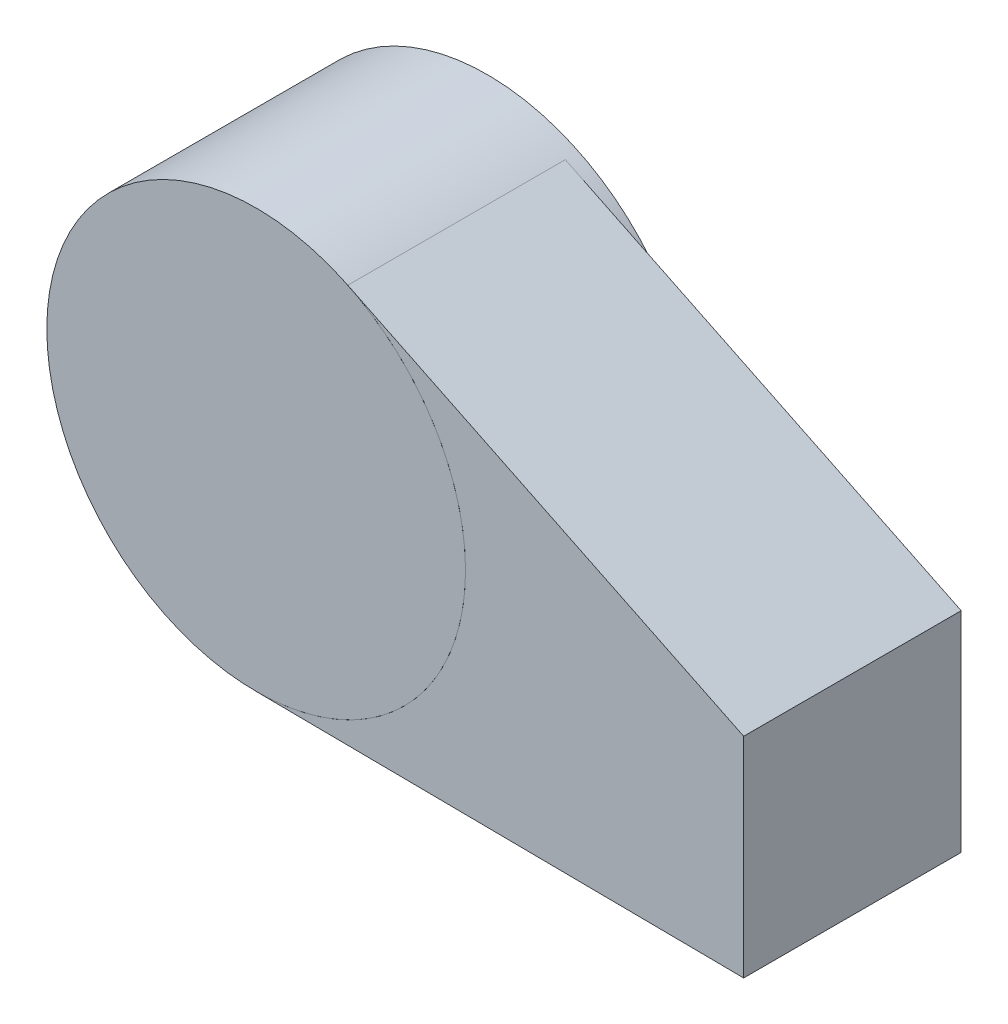
ISO-10303-21;
HEADER;
FILE_DESCRIPTION(('STEP AP214'),'2;1');
FILE_NAME('part.step','',(''),(''),'','','');
FILE_SCHEMA(('AUTOMOTIVE_DESIGN { 1 0 10303 214 1 1 1 1 }'));
ENDSEC;
DATA;
#1=APPLICATION_CONTEXT('core data for automotive mechanical design processes');
#2=APPLICATION_PROTOCOL_DEFINITION('international standard','automotive_design',2000,#1);
#3=PRODUCT_CONTEXT('',#1,'mechanical');
#4=PRODUCT('Part','Part','',(#3));
#5=PRODUCT_RELATED_PRODUCT_CATEGORY('part','',(#4));
#6=PRODUCT_DEFINITION_FORMATION('','',#4);
#7=PRODUCT_DEFINITION_CONTEXT('part definition',#1,'design');
#8=PRODUCT_DEFINITION('design','',#6,#7);
#9=PRODUCT_DEFINITION_SHAPE('','',#8);
#10=(LENGTH_UNIT() NAMED_UNIT(*) SI_UNIT(.MILLI.,.METRE.));
#11=(NAMED_UNIT(*) PLANE_ANGLE_UNIT() SI_UNIT($,.RADIAN.));
#12=(NAMED_UNIT(*) SI_UNIT($,.STERADIAN.) SOLID_ANGLE_UNIT());
#13=UNCERTAINTY_MEASURE_WITH_UNIT(LENGTH_MEASURE(1.E-05),#10,'distance_accuracy_value','');
#14=(GEOMETRIC_REPRESENTATION_CONTEXT(3) GLOBAL_UNCERTAINTY_ASSIGNED_CONTEXT((#13)) GLOBAL_UNIT_ASSIGNED_CONTEXT((#10,
#11,#12)) REPRESENTATION_CONTEXT('',''));
#15=CARTESIAN_POINT('',(0.,0.,0.));
#16=DIRECTION('',(0.,0.,1.));
#17=DIRECTION('',(1.,0.,0.));
#18=AXIS2_PLACEMENT_3D('',#15,#16,#17);
#19=CARTESIAN_POINT('',(0.,0.,80.));
#20=DIRECTION('',(0.,0.,-1.));
#21=DIRECTION('',(-1.,0.,0.));
#22=AXIS2_PLACEMENT_3D('',#19,#20,#21);
#23=CYLINDRICAL_SURFACE('',#22,77.);
#24=CARTESIAN_POINT('',(0.,0.,80.));
#25=DIRECTION('',(0.,0.,-1.));
#26=DIRECTION('',(-1.,0.,0.));
#27=AXIS2_PLACEMENT_3D('',#24,#25,#26);
#28=CIRCLE('',#27,77.);
#29=CARTESIAN_POINT('',(-77.,0.,80.));
#30=VERTEX_POINT('',#29);
#31=EDGE_CURVE('E11',#30,#30,#28,.T.);
#32=ORIENTED_EDGE('',*,*,#31,.T.);
#33=EDGE_LOOP('',(#32));
#34=FACE_BOUND('',#33,.T.);
#35=CARTESIAN_POINT('',(0.,0.,-5.));
#36=DIRECTION('',(0.,0.,-1.));
#37=DIRECTION('',(-1.,0.,0.));
#38=AXIS2_PLACEMENT_3D('',#35,#36,#37);
#39=CIRCLE('',#38,77.);
#40=CARTESIAN_POINT('',(-77.,0.,-5.));
#41=VERTEX_POINT('',#40);
#42=EDGE_CURVE('E52',#41,#41,#39,.T.);
#43=ORIENTED_EDGE('',*,*,#42,.F.);
#44=EDGE_LOOP('',(#43));
#45=FACE_BOUND('',#44,.T.);
#46=ADVANCED_FACE('F46',(#34,#45),#23,.T.);
#47=CARTESIAN_POINT('',(0.,0.,80.));
#48=DIRECTION('',(0.,0.,-1.));
#49=DIRECTION('',(-1.,0.,0.));
#50=AXIS2_PLACEMENT_3D('',#47,#48,#49);
#51=PLANE('',#50);
#52=ORIENTED_EDGE('',*,*,#31,.F.);
#53=EDGE_LOOP('',(#52));
#54=FACE_BOUND('',#53,.T.);
#55=ADVANCED_FACE('F61',(#54),#51,.F.);
#56=CARTESIAN_POINT('',(0.,0.,-5.));
#57=DIRECTION('',(0.,0.,-1.));
#58=DIRECTION('',(-1.,0.,0.));
#59=AXIS2_PLACEMENT_3D('',#56,#57,#58);
#60=PLANE('',#59);
#61=ORIENTED_EDGE('',*,*,#42,.T.);
#62=EDGE_LOOP('',(#61));
#63=FACE_BOUND('',#62,.T.);
#64=ADVANCED_FACE('F58',(#63),#60,.T.);
#65=CLOSED_SHELL('',(#46,#55,#64));
#66=MANIFOLD_SOLID_BREP('B2',#65);
#67=CARTESIAN_POINT('',(0.,0.,80.));
#68=DIRECTION('',(0.,0.,-1.));
#69=DIRECTION('',(-1.,0.,0.));
#70=AXIS2_PLACEMENT_3D('',#67,#68,#69);
#71=CYLINDRICAL_SURFACE('',#70,77.);
#72=CARTESIAN_POINT('',(0.,0.,0.));
#73=DIRECTION('',(0.,0.,1.));
#74=DIRECTION('',(1.,0.,0.));
#75=AXIS2_PLACEMENT_3D('',#72,#73,#74);
#76=CIRCLE('',#75,77.);
#77=CARTESIAN_POINT('',(-0.698256275232512,-76.9968339490274,0.));
#78=VERTEX_POINT('',#77);
#79=CARTESIAN_POINT('',(33.6962577201021,69.2355560074479,0.));
#80=VERTEX_POINT('',#79);
#81=EDGE_CURVE('E155',#78,#80,#76,.T.);
#82=ORIENTED_EDGE('',*,*,#81,.F.);
#83=DIRECTION('',(0.,0.,-1.));
#84=VECTOR('',#83,1.);
#85=CARTESIAN_POINT('',(-0.698256275232512,-76.9968339490274,80.));
#86=LINE('',#85,#84);
#87=CARTESIAN_POINT('',(-0.698256275232512,-76.9968339490274,80.));
#88=VERTEX_POINT('',#87);
#89=EDGE_CURVE('E44',#88,#78,#86,.T.);
#90=ORIENTED_EDGE('',*,*,#89,.F.);
#91=CARTESIAN_POINT('',(0.,0.,80.));
#92=DIRECTION('',(0.,0.,1.));
#93=DIRECTION('',(1.,0.,0.));
#94=AXIS2_PLACEMENT_3D('',#91,#92,#93);
#95=CIRCLE('',#94,77.);
#96=CARTESIAN_POINT('',(33.6962577201021,69.2355560074479,80.));
#97=VERTEX_POINT('',#96);
#98=EDGE_CURVE('E149',#88,#97,#95,.T.);
#99=ORIENTED_EDGE('',*,*,#98,.T.);
#100=DIRECTION('',(0.,0.,-1.));
#101=VECTOR('',#100,1.);
#102=CARTESIAN_POINT('',(33.6962577201021,69.2355560074479,80.));
#103=LINE('',#102,#101);
#104=EDGE_CURVE('E130',#97,#80,#103,.T.);
#105=ORIENTED_EDGE('',*,*,#104,.T.);
#106=EDGE_LOOP('',(#82,#90,#99,#105));
#107=FACE_BOUND('',#106,.T.);
#108=ADVANCED_FACE('F92',(#107),#71,.F.);
#109=CARTESIAN_POINT('',(-0.698256275232511,-76.9968339490274,80.));
#110=DIRECTION('',(-0.00906826331470794,-0.999958882454901,0.));
#111=DIRECTION('',(0.999958882454901,-0.00906826331470794,0.));
#112=AXIS2_PLACEMENT_3D('',#109,#110,#111);
#113=PLANE('',#112);
#114=DIRECTION('',(-0.999958882454901,0.00906826331470794,0.));
#115=VECTOR('',#114,1.);
#116=CARTESIAN_POINT('',(-0.698256275232511,-76.9968339490274,0.));
#117=LINE('',#116,#115);
#118=CARTESIAN_POINT('',(179.301743724767,-78.6291884640852,0.));
#119=VERTEX_POINT('',#118);
#120=EDGE_CURVE('E143',#119,#78,#117,.T.);
#121=ORIENTED_EDGE('',*,*,#120,.F.);
#122=DIRECTION('',(0.,0.,-1.));
#123=VECTOR('',#122,1.);
#124=CARTESIAN_POINT('',(179.301743724767,-78.6291884640852,80.));
#125=LINE('',#124,#123);
#126=CARTESIAN_POINT('',(179.301743724767,-78.6291884640852,80.));
#127=VERTEX_POINT('',#126);
#128=EDGE_CURVE('E100',#127,#119,#125,.T.);
#129=ORIENTED_EDGE('',*,*,#128,.F.);
#130=DIRECTION('',(-0.999958882454901,0.00906826331470794,0.));
#131=VECTOR('',#130,1.);
#132=CARTESIAN_POINT('',(-0.698256275232511,-76.9968339490274,80.));
#133=LINE('',#132,#131);
#134=EDGE_CURVE('E141',#127,#88,#133,.T.);
#135=ORIENTED_EDGE('',*,*,#134,.T.);
#136=ORIENTED_EDGE('',*,*,#89,.T.);
#137=EDGE_LOOP('',(#121,#129,#135,#136));
#138=FACE_BOUND('',#137,.T.);
#139=ADVANCED_FACE('F139',(#138),#113,.T.);
#140=CARTESIAN_POINT('',(179.301743724767,0.,80.));
#141=DIRECTION('',(-1.,0.,0.));
#142=DIRECTION('',(0.,0.,1.));
#143=AXIS2_PLACEMENT_3D('',#140,#141,#142);
#144=PLANE('',#143);
#145=DIRECTION('',(0.,1.,0.));
#146=VECTOR('',#145,1.);
#147=CARTESIAN_POINT('',(179.301743724767,0.,0.));
#148=LINE('',#147,#146);
#149=CARTESIAN_POINT('',(179.301743724767,-1.62918842164475,0.));
#150=VERTEX_POINT('',#149);
#151=EDGE_CURVE('E123',#119,#150,#148,.T.);
#152=ORIENTED_EDGE('',*,*,#151,.T.);
#153=DIRECTION('',(0.,0.,-1.));
#154=VECTOR('',#153,1.);
#155=CARTESIAN_POINT('',(179.301743724767,-1.62918842164475,80.));
#156=LINE('',#155,#154);
#157=CARTESIAN_POINT('',(179.301743724767,-1.62918842164475,80.));
#158=VERTEX_POINT('',#157);
#159=EDGE_CURVE('E144',#158,#150,#156,.T.);
#160=ORIENTED_EDGE('',*,*,#159,.F.);
#161=DIRECTION('',(0.,1.,0.));
#162=VECTOR('',#161,1.);
#163=CARTESIAN_POINT('',(179.301743724767,0.,80.));
#164=LINE('',#163,#162);
#165=EDGE_CURVE('E145',#127,#158,#164,.T.);
#166=ORIENTED_EDGE('',*,*,#165,.F.);
#167=ORIENTED_EDGE('',*,*,#128,.T.);
#168=EDGE_LOOP('',(#152,#160,#166,#167));
#169=FACE_BOUND('',#168,.T.);
#170=ADVANCED_FACE('F146',(#169),#144,.F.);
#171=CARTESIAN_POINT('',(33.6962577201021,69.2355560074479,80.));
#172=DIRECTION('',(-0.437613736624703,-0.899163065031791,0.));
#173=DIRECTION('',(0.899163065031791,-0.437613736624703,0.));
#174=AXIS2_PLACEMENT_3D('',#171,#172,#173);
#175=PLANE('',#174);
#176=DIRECTION('',(-0.899163065031791,0.437613736624703,0.));
#177=VECTOR('',#176,1.);
#178=CARTESIAN_POINT('',(33.6962577201021,69.2355560074479,0.));
#179=LINE('',#178,#177);
#180=EDGE_CURVE('E151',#150,#80,#179,.T.);
#181=ORIENTED_EDGE('',*,*,#180,.T.);
#182=ORIENTED_EDGE('',*,*,#104,.F.);
#183=DIRECTION('',(-0.899163065031791,0.437613736624703,0.));
#184=VECTOR('',#183,1.);
#185=CARTESIAN_POINT('',(33.6962577201021,69.2355560074479,80.));
#186=LINE('',#185,#184);
#187=EDGE_CURVE('E108',#158,#97,#186,.T.);
#188=ORIENTED_EDGE('',*,*,#187,.F.);
#189=ORIENTED_EDGE('',*,*,#159,.T.);
#190=EDGE_LOOP('',(#181,#182,#188,#189));
#191=FACE_BOUND('',#190,.T.);
#192=ADVANCED_FACE('F164',(#191),#175,.F.);
#193=CARTESIAN_POINT('',(0.,0.,80.));
#194=DIRECTION('',(0.,0.,1.));
#195=DIRECTION('',(1.,0.,0.));
#196=AXIS2_PLACEMENT_3D('',#193,#194,#195);
#197=PLANE('',#196);
#198=ORIENTED_EDGE('',*,*,#98,.F.);
#199=ORIENTED_EDGE('',*,*,#134,.F.);
#200=ORIENTED_EDGE('',*,*,#165,.T.);
#201=ORIENTED_EDGE('',*,*,#187,.T.);
#202=EDGE_LOOP('',(#198,#199,#200,#201));
#203=FACE_BOUND('',#202,.T.);
#204=ADVANCED_FACE('F148',(#203),#197,.T.);
#205=CARTESIAN_POINT('',(0.,0.,0.));
#206=DIRECTION('',(0.,0.,1.));
#207=DIRECTION('',(1.,0.,0.));
#208=AXIS2_PLACEMENT_3D('',#205,#206,#207);
#209=PLANE('',#208);
#210=ORIENTED_EDGE('',*,*,#81,.T.);
#211=ORIENTED_EDGE('',*,*,#180,.F.);
#212=ORIENTED_EDGE('',*,*,#151,.F.);
#213=ORIENTED_EDGE('',*,*,#120,.T.);
#214=EDGE_LOOP('',(#210,#211,#212,#213));
#215=FACE_BOUND('',#214,.T.);
#216=ADVANCED_FACE('F166',(#215),#209,.F.);
#217=CLOSED_SHELL('',(#108,#139,#170,#192,#204,#216));
#218=MANIFOLD_SOLID_BREP('B6',#217);
#219=ADVANCED_BREP_SHAPE_REPRESENTATION('',(#18,#66,#218),#14);
#220=SHAPE_DEFINITION_REPRESENTATION(#9,#219);
ENDSEC;
END-ISO-10303-21;
